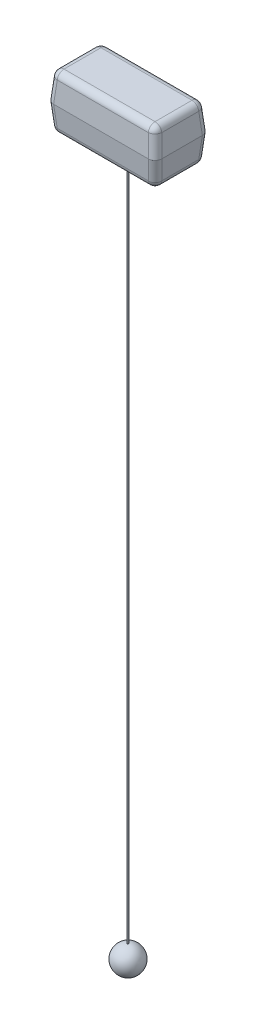
ISO-10303-21;
HEADER;
FILE_DESCRIPTION(('STEP AP214'),'2;1');
FILE_NAME('part.step','',(''),(''),'','','');
FILE_SCHEMA(('AUTOMOTIVE_DESIGN { 1 0 10303 214 1 1 1 1 }'));
ENDSEC;
DATA;
#1=APPLICATION_CONTEXT('core data for automotive mechanical design processes');
#2=APPLICATION_PROTOCOL_DEFINITION('international standard','automotive_design',2000,#1);
#3=PRODUCT_CONTEXT('',#1,'mechanical');
#4=PRODUCT('Part','Part','',(#3));
#5=PRODUCT_RELATED_PRODUCT_CATEGORY('part','',(#4));
#6=PRODUCT_DEFINITION_FORMATION('','',#4);
#7=PRODUCT_DEFINITION_CONTEXT('part definition',#1,'design');
#8=PRODUCT_DEFINITION('design','',#6,#7);
#9=PRODUCT_DEFINITION_SHAPE('','',#8);
#10=(LENGTH_UNIT() NAMED_UNIT(*) SI_UNIT(.MILLI.,.METRE.));
#11=(NAMED_UNIT(*) PLANE_ANGLE_UNIT() SI_UNIT($,.RADIAN.));
#12=(NAMED_UNIT(*) SI_UNIT($,.STERADIAN.) SOLID_ANGLE_UNIT());
#13=UNCERTAINTY_MEASURE_WITH_UNIT(LENGTH_MEASURE(1.E-05),#10,'distance_accuracy_value','');
#14=(GEOMETRIC_REPRESENTATION_CONTEXT(3) GLOBAL_UNCERTAINTY_ASSIGNED_CONTEXT((#13)) GLOBAL_UNIT_ASSIGNED_CONTEXT((#10,
#11,#12)) REPRESENTATION_CONTEXT('',''));
#15=CARTESIAN_POINT('',(0.,0.,0.));
#16=DIRECTION('',(0.,0.,1.));
#17=DIRECTION('',(1.,0.,0.));
#18=AXIS2_PLACEMENT_3D('',#15,#16,#17);
#19=CARTESIAN_POINT('',(0.,-685.8,0.));
#20=DIRECTION('',(0.,-1.,0.));
#21=DIRECTION('',(1.,0.,0.));
#22=AXIS2_PLACEMENT_3D('',#19,#20,#21);
#23=SPHERICAL_SURFACE('',#22,12.7);
#24=CARTESIAN_POINT('',(0.,-698.5,0.));
#25=VERTEX_POINT('',#24);
#26=VERTEX_LOOP('',#25);
#27=FACE_BOUND('',#26,.T.);
#28=ADVANCED_FACE('F40',(#27),#23,.T.);
#29=CLOSED_SHELL('',(#28));
#30=MANIFOLD_SOLID_BREP('B2',#29);
#31=CARTESIAN_POINT('',(0.,-685.8,0.));
#32=DIRECTION('',(0.,1.,0.));
#33=DIRECTION('',(0.,0.,1.));
#34=AXIS2_PLACEMENT_3D('',#31,#32,#33);
#35=CYLINDRICAL_SURFACE('',#34,0.635);
#36=CARTESIAN_POINT('',(0.,-685.8,0.));
#37=DIRECTION('',(0.,-1.,0.));
#38=DIRECTION('',(0.,0.,-1.));
#39=AXIS2_PLACEMENT_3D('',#36,#37,#38);
#40=CIRCLE('',#39,0.635);
#41=CARTESIAN_POINT('',(0.,-685.8,-0.635));
#42=VERTEX_POINT('',#41);
#43=EDGE_CURVE('E39',#42,#42,#40,.T.);
#44=ORIENTED_EDGE('',*,*,#43,.F.);
#45=EDGE_LOOP('',(#44));
#46=FACE_BOUND('',#45,.T.);
#47=CARTESIAN_POINT('',(0.,-25.4,0.));
#48=DIRECTION('',(0.,-1.,0.));
#49=DIRECTION('',(0.,0.,-1.));
#50=AXIS2_PLACEMENT_3D('',#47,#48,#49);
#51=CIRCLE('',#50,0.635);
#52=CARTESIAN_POINT('',(0.,-25.4,-0.635));
#53=VERTEX_POINT('',#52);
#54=EDGE_CURVE('E65',#53,#53,#51,.T.);
#55=ORIENTED_EDGE('',*,*,#54,.T.);
#56=EDGE_LOOP('',(#55));
#57=FACE_BOUND('',#56,.T.);
#58=ADVANCED_FACE('F62',(#46,#57),#35,.T.);
#59=CARTESIAN_POINT('',(0.,-685.8,0.));
#60=DIRECTION('',(0.,-1.,0.));
#61=DIRECTION('',(0.,0.,-1.));
#62=AXIS2_PLACEMENT_3D('',#59,#60,#61);
#63=PLANE('',#62);
#64=ORIENTED_EDGE('',*,*,#43,.T.);
#65=EDGE_LOOP('',(#64));
#66=FACE_BOUND('',#65,.T.);
#67=ADVANCED_FACE('F77',(#66),#63,.T.);
#68=CARTESIAN_POINT('',(0.,-25.4,0.));
#69=DIRECTION('',(0.,-1.,0.));
#70=DIRECTION('',(0.,0.,-1.));
#71=AXIS2_PLACEMENT_3D('',#68,#69,#70);
#72=PLANE('',#71);
#73=ORIENTED_EDGE('',*,*,#54,.F.);
#74=EDGE_LOOP('',(#73));
#75=FACE_BOUND('',#74,.T.);
#76=ADVANCED_FACE('F75',(#75),#72,.F.);
#77=CLOSED_SHELL('',(#58,#67,#76));
#78=MANIFOLD_SOLID_BREP('B6',#77);
#79=CARTESIAN_POINT('',(50.8,0.,25.4));
#80=DIRECTION('',(0.996194698091746,-0.0871557427476584,0.));
#81=DIRECTION('',(0.0871557427476584,0.996194698091746,0.));
#82=AXIS2_PLACEMENT_3D('',#79,#80,#81);
#83=PLANE('',#82);
#84=DIRECTION('',(0.,0.,-1.));
#85=VECTOR('',#84,1.);
#86=CARTESIAN_POINT('',(49.0849213243135,-19.6034389664476,25.4));
#87=LINE('',#86,#85);
#88=CARTESIAN_POINT('',(49.0849213243135,-19.6034389664476,17.3590849914309));
#89=VERTEX_POINT('',#88);
#90=CARTESIAN_POINT('',(49.0849213243135,-19.6034389664476,-17.3590849914309));
#91=VERTEX_POINT('',#90);
#92=EDGE_CURVE('E283',#89,#91,#87,.T.);
#93=ORIENTED_EDGE('',*,*,#92,.T.);
#94=DIRECTION('',(0.0868265938642478,0.992432509138967,-0.0868265938642478));
#95=VECTOR('',#94,1.);
#96=CARTESIAN_POINT('',(50.4647156220374,-3.83231797641118,-18.7388792891548));
#97=LINE('',#96,#95);
#98=CARTESIAN_POINT('',(50.8,0.,-19.0741636671174));
#99=VERTEX_POINT('',#98);
#100=EDGE_CURVE('E286',#91,#99,#97,.T.);
#101=ORIENTED_EDGE('',*,*,#100,.T.);
#102=DIRECTION('',(0.,0.,-1.));
#103=VECTOR('',#102,1.);
#104=CARTESIAN_POINT('',(50.8,0.,25.4));
#105=LINE('',#104,#103);
#106=CARTESIAN_POINT('',(50.8,0.,19.0741636671174));
#107=VERTEX_POINT('',#106);
#108=EDGE_CURVE('E236',#107,#99,#105,.T.);
#109=ORIENTED_EDGE('',*,*,#108,.F.);
#110=DIRECTION('',(0.0868265938642478,0.992432509138967,0.0868265938642478));
#111=VECTOR('',#110,1.);
#112=CARTESIAN_POINT('',(50.8476895780624,0.545094371550039,19.1218532451798));
#113=LINE('',#112,#111);
#114=EDGE_CURVE('E281',#107,#89,#113,.F.);
#115=ORIENTED_EDGE('',*,*,#114,.T.);
#116=EDGE_LOOP('',(#93,#101,#109,#115));
#117=FACE_BOUND('',#116,.T.);
#118=ADVANCED_FACE('F103',(#117),#83,.T.);
#119=CARTESIAN_POINT('',(-50.8,0.,25.4));
#120=DIRECTION('',(0.,-0.0871557427476584,0.996194698091746));
#121=DIRECTION('',(0.,-0.996194698091746,-0.0871557427476584));
#122=AXIS2_PLACEMENT_3D('',#119,#120,#121);
#123=PLANE('',#122);
#124=DIRECTION('',(1.,0.,0.));
#125=VECTOR('',#124,1.);
#126=CARTESIAN_POINT('',(-50.8,0.,25.4));
#127=LINE('',#126,#125);
#128=CARTESIAN_POINT('',(-44.4741636671174,0.,25.4));
#129=VERTEX_POINT('',#128);
#130=CARTESIAN_POINT('',(44.4741636671174,0.,25.4));
#131=VERTEX_POINT('',#130);
#132=EDGE_CURVE('E250',#129,#131,#127,.T.);
#133=ORIENTED_EDGE('',*,*,#132,.F.);
#134=DIRECTION('',(-0.0868265938642478,0.992432509138967,0.0868265938642478));
#135=VECTOR('',#134,1.);
#136=CARTESIAN_POINT('',(-44.5218532451798,0.545094371550039,25.4476895780624));
#137=LINE('',#136,#135);
#138=CARTESIAN_POINT('',(-42.7590849914309,-19.6034389664476,23.6849213243135));
#139=VERTEX_POINT('',#138);
#140=EDGE_CURVE('E279',#129,#139,#137,.F.);
#141=ORIENTED_EDGE('',*,*,#140,.T.);
#142=DIRECTION('',(1.,0.,0.));
#143=VECTOR('',#142,1.);
#144=CARTESIAN_POINT('',(-50.8,-19.6034389664476,23.6849213243135));
#145=LINE('',#144,#143);
#146=CARTESIAN_POINT('',(42.7590849914309,-19.6034389664476,23.6849213243135));
#147=VERTEX_POINT('',#146);
#148=EDGE_CURVE('E276',#139,#147,#145,.T.);
#149=ORIENTED_EDGE('',*,*,#148,.T.);
#150=DIRECTION('',(0.0868265938642478,0.992432509138967,0.0868265938642478));
#151=VECTOR('',#150,1.);
#152=CARTESIAN_POINT('',(43.7559053331298,-8.20973032437241,24.6817416660124));
#153=LINE('',#152,#151);
#154=EDGE_CURVE('E274',#147,#131,#153,.T.);
#155=ORIENTED_EDGE('',*,*,#154,.T.);
#156=EDGE_LOOP('',(#133,#141,#149,#155));
#157=FACE_BOUND('',#156,.T.);
#158=ADVANCED_FACE('F411',(#157),#123,.T.);
#159=CARTESIAN_POINT('',(-50.8,0.,25.4));
#160=DIRECTION('',(-0.996194698091746,-0.0871557427476584,0.));
#161=DIRECTION('',(0.0871557427476584,-0.996194698091746,0.));
#162=AXIS2_PLACEMENT_3D('',#159,#160,#161);
#163=PLANE('',#162);
#164=DIRECTION('',(0.,0.,1.));
#165=VECTOR('',#164,1.);
#166=CARTESIAN_POINT('',(-50.8,0.,25.4));
#167=LINE('',#166,#165);
#168=CARTESIAN_POINT('',(-50.8,0.,-19.0741636671174));
#169=VERTEX_POINT('',#168);
#170=CARTESIAN_POINT('',(-50.8,0.,19.0741636671174));
#171=VERTEX_POINT('',#170);
#172=EDGE_CURVE('E235',#169,#171,#167,.T.);
#173=ORIENTED_EDGE('',*,*,#172,.F.);
#174=DIRECTION('',(-0.0868265938642478,0.992432509138967,-0.0868265938642478));
#175=VECTOR('',#174,1.);
#176=CARTESIAN_POINT('',(-50.4647156220374,-3.83231797641118,-18.7388792891548));
#177=LINE('',#176,#175);
#178=CARTESIAN_POINT('',(-49.0849213243135,-19.6034389664476,-17.3590849914309));
#179=VERTEX_POINT('',#178);
#180=EDGE_CURVE('E272',#169,#179,#177,.F.);
#181=ORIENTED_EDGE('',*,*,#180,.T.);
#182=DIRECTION('',(0.,0.,1.));
#183=VECTOR('',#182,1.);
#184=CARTESIAN_POINT('',(-49.0849213243135,-19.6034389664476,25.4));
#185=LINE('',#184,#183);
#186=CARTESIAN_POINT('',(-49.0849213243135,-19.6034389664476,17.3590849914309));
#187=VERTEX_POINT('',#186);
#188=EDGE_CURVE('E269',#179,#187,#185,.T.);
#189=ORIENTED_EDGE('',*,*,#188,.T.);
#190=DIRECTION('',(-0.0868265938642478,0.992432509138967,0.0868265938642478));
#191=VECTOR('',#190,1.);
#192=CARTESIAN_POINT('',(-50.8476895780624,0.545094371550039,19.1218532451798));
#193=LINE('',#192,#191);
#194=EDGE_CURVE('E267',#187,#171,#193,.T.);
#195=ORIENTED_EDGE('',*,*,#194,.T.);
#196=EDGE_LOOP('',(#173,#181,#189,#195));
#197=FACE_BOUND('',#196,.T.);
#198=ADVANCED_FACE('F459',(#197),#163,.T.);
#199=CARTESIAN_POINT('',(-50.8,0.,-25.4));
#200=DIRECTION('',(0.,-0.0871557427476584,-0.996194698091746));
#201=DIRECTION('',(0.,0.996194698091746,-0.0871557427476584));
#202=AXIS2_PLACEMENT_3D('',#199,#200,#201);
#203=PLANE('',#202);
#204=DIRECTION('',(-1.,0.,0.));
#205=VECTOR('',#204,1.);
#206=CARTESIAN_POINT('',(-50.8,-19.6034389664476,-23.6849213243135));
#207=LINE('',#206,#205);
#208=CARTESIAN_POINT('',(42.7590849914309,-19.6034389664476,-23.6849213243135));
#209=VERTEX_POINT('',#208);
#210=CARTESIAN_POINT('',(-42.7590849914309,-19.6034389664476,-23.6849213243135));
#211=VERTEX_POINT('',#210);
#212=EDGE_CURVE('E249',#209,#211,#207,.T.);
#213=ORIENTED_EDGE('',*,*,#212,.T.);
#214=DIRECTION('',(-0.0868265938642478,0.992432509138967,-0.0868265938642478));
#215=VECTOR('',#214,1.);
#216=CARTESIAN_POINT('',(-44.5218532451798,0.545094371550039,-25.4476895780624));
#217=LINE('',#216,#215);
#218=CARTESIAN_POINT('',(-44.4741636671174,0.,-25.4));
#219=VERTEX_POINT('',#218);
#220=EDGE_CURVE('E234',#211,#219,#217,.T.);
#221=ORIENTED_EDGE('',*,*,#220,.T.);
#222=DIRECTION('',(-1.,0.,0.));
#223=VECTOR('',#222,1.);
#224=CARTESIAN_POINT('',(-50.8,0.,-25.4));
#225=LINE('',#224,#223);
#226=CARTESIAN_POINT('',(44.4741636671174,0.,-25.4));
#227=VERTEX_POINT('',#226);
#228=EDGE_CURVE('E217',#227,#219,#225,.T.);
#229=ORIENTED_EDGE('',*,*,#228,.F.);
#230=DIRECTION('',(0.0868265938642478,0.992432509138967,-0.0868265938642478));
#231=VECTOR('',#230,1.);
#232=CARTESIAN_POINT('',(43.7559053331298,-8.20973032437241,-24.6817416660124));
#233=LINE('',#232,#231);
#234=EDGE_CURVE('E231',#227,#209,#233,.F.);
#235=ORIENTED_EDGE('',*,*,#234,.T.);
#236=EDGE_LOOP('',(#213,#221,#229,#235));
#237=FACE_BOUND('',#236,.T.);
#238=ADVANCED_FACE('F229',(#237),#203,.T.);
#239=CARTESIAN_POINT('',(50.8,-25.4,-25.4));
#240=DIRECTION('',(0.,-1.,0.));
#241=DIRECTION('',(0.,0.,-1.));
#242=AXIS2_PLACEMENT_3D('',#239,#240,#241);
#243=PLANE('',#242);
#244=DIRECTION('',(0.,0.,1.));
#245=VECTOR('',#244,1.);
#246=CARTESIAN_POINT('',(-42.7590849914309,-25.4,-25.4));
#247=LINE('',#246,#245);
#248=CARTESIAN_POINT('',(-42.7590849914309,-25.4,17.3590849914309));
#249=VERTEX_POINT('',#248);
#250=CARTESIAN_POINT('',(-42.7590849914309,-25.4,-17.3590849914309));
#251=VERTEX_POINT('',#250);
#252=EDGE_CURVE('E262',#249,#251,#247,.F.);
#253=ORIENTED_EDGE('',*,*,#252,.T.);
#254=DIRECTION('',(-1.,0.,0.));
#255=VECTOR('',#254,1.);
#256=CARTESIAN_POINT('',(50.8,-25.4,-17.3590849914309));
#257=LINE('',#256,#255);
#258=CARTESIAN_POINT('',(42.7590849914309,-25.4,-17.3590849914309));
#259=VERTEX_POINT('',#258);
#260=EDGE_CURVE('E264',#251,#259,#257,.F.);
#261=ORIENTED_EDGE('',*,*,#260,.T.);
#262=DIRECTION('',(0.,0.,-1.));
#263=VECTOR('',#262,1.);
#264=CARTESIAN_POINT('',(42.7590849914309,-25.4,-25.4));
#265=LINE('',#264,#263);
#266=CARTESIAN_POINT('',(42.7590849914309,-25.4,17.3590849914309));
#267=VERTEX_POINT('',#266);
#268=EDGE_CURVE('E258',#259,#267,#265,.F.);
#269=ORIENTED_EDGE('',*,*,#268,.T.);
#270=DIRECTION('',(1.,0.,0.));
#271=VECTOR('',#270,1.);
#272=CARTESIAN_POINT('',(50.8,-25.4,17.3590849914309));
#273=LINE('',#272,#271);
#274=EDGE_CURVE('E260',#267,#249,#273,.F.);
#275=ORIENTED_EDGE('',*,*,#274,.T.);
#276=EDGE_LOOP('',(#253,#261,#269,#275));
#277=FACE_BOUND('',#276,.T.);
#278=ADVANCED_FACE('F486',(#277),#243,.T.);
#279=CARTESIAN_POINT('',(50.8,0.,25.4));
#280=DIRECTION('',(0.996194698091746,0.0871557427476584,0.));
#281=DIRECTION('',(-0.0871557427476584,0.996194698091746,0.));
#282=AXIS2_PLACEMENT_3D('',#279,#280,#281);
#283=PLANE('',#282);
#284=ORIENTED_EDGE('',*,*,#108,.T.);
#285=DIRECTION('',(-0.0868265938642478,0.992432509138967,0.0868265938642478));
#286=VECTOR('',#285,1.);
#287=CARTESIAN_POINT('',(50.4647156220374,3.83231797641118,-18.7388792891548));
#288=LINE('',#287,#286);
#289=CARTESIAN_POINT('',(49.0849213243135,19.6034389664476,-17.3590849914309));
#290=VERTEX_POINT('',#289);
#291=EDGE_CURVE('E60',#99,#290,#288,.T.);
#292=ORIENTED_EDGE('',*,*,#291,.T.);
#293=DIRECTION('',(0.,0.,-1.));
#294=VECTOR('',#293,1.);
#295=CARTESIAN_POINT('',(49.0849213243135,19.6034389664476,25.4));
#296=LINE('',#295,#294);
#297=CARTESIAN_POINT('',(49.0849213243135,19.6034389664476,17.3590849914309));
#298=VERTEX_POINT('',#297);
#299=EDGE_CURVE('E112',#290,#298,#296,.F.);
#300=ORIENTED_EDGE('',*,*,#299,.T.);
#301=DIRECTION('',(-0.0868265938642478,0.992432509138967,-0.0868265938642478));
#302=VECTOR('',#301,1.);
#303=CARTESIAN_POINT('',(50.8476895780624,-0.545094371550039,19.1218532451798));
#304=LINE('',#303,#302);
#305=EDGE_CURVE('E311',#298,#107,#304,.F.);
#306=ORIENTED_EDGE('',*,*,#305,.T.);
#307=EDGE_LOOP('',(#284,#292,#300,#306));
#308=FACE_BOUND('',#307,.T.);
#309=ADVANCED_FACE('F695',(#308),#283,.T.);
#310=CARTESIAN_POINT('',(-50.8,0.,-25.4));
#311=DIRECTION('',(0.,0.0871557427476584,-0.996194698091746));
#312=DIRECTION('',(0.,0.996194698091746,0.0871557427476584));
#313=AXIS2_PLACEMENT_3D('',#310,#311,#312);
#314=PLANE('',#313);
#315=ORIENTED_EDGE('',*,*,#228,.T.);
#316=DIRECTION('',(0.0868265938642478,0.992432509138967,0.0868265938642478));
#317=VECTOR('',#316,1.);
#318=CARTESIAN_POINT('',(-44.5218532451798,-0.545094371550039,-25.4476895780624));
#319=LINE('',#318,#317);
#320=CARTESIAN_POINT('',(-42.7590849914309,19.6034389664476,-23.6849213243135));
#321=VERTEX_POINT('',#320);
#322=EDGE_CURVE('E309',#219,#321,#319,.T.);
#323=ORIENTED_EDGE('',*,*,#322,.T.);
#324=DIRECTION('',(-1.,0.,0.));
#325=VECTOR('',#324,1.);
#326=CARTESIAN_POINT('',(-50.8,19.6034389664476,-23.6849213243135));
#327=LINE('',#326,#325);
#328=CARTESIAN_POINT('',(42.7590849914309,19.6034389664476,-23.6849213243135));
#329=VERTEX_POINT('',#328);
#330=EDGE_CURVE('E220',#321,#329,#327,.F.);
#331=ORIENTED_EDGE('',*,*,#330,.T.);
#332=DIRECTION('',(-0.0868265938642478,0.992432509138967,0.0868265938642478));
#333=VECTOR('',#332,1.);
#334=CARTESIAN_POINT('',(43.7559053331298,8.20973032437241,-24.6817416660124));
#335=LINE('',#334,#333);
#336=EDGE_CURVE('E214',#329,#227,#335,.F.);
#337=ORIENTED_EDGE('',*,*,#336,.T.);
#338=EDGE_LOOP('',(#315,#323,#331,#337));
#339=FACE_BOUND('',#338,.T.);
#340=ADVANCED_FACE('F216',(#339),#314,.T.);
#341=CARTESIAN_POINT('',(-50.8,0.,25.4));
#342=DIRECTION('',(-0.996194698091746,0.0871557427476584,0.));
#343=DIRECTION('',(-0.0871557427476584,-0.996194698091746,0.));
#344=AXIS2_PLACEMENT_3D('',#341,#342,#343);
#345=PLANE('',#344);
#346=DIRECTION('',(0.,0.,1.));
#347=VECTOR('',#346,1.);
#348=CARTESIAN_POINT('',(-49.0849213243135,19.6034389664476,25.4));
#349=LINE('',#348,#347);
#350=CARTESIAN_POINT('',(-49.0849213243135,19.6034389664476,17.3590849914309));
#351=VERTEX_POINT('',#350);
#352=CARTESIAN_POINT('',(-49.0849213243135,19.6034389664476,-17.3590849914309));
#353=VERTEX_POINT('',#352);
#354=EDGE_CURVE('E305',#351,#353,#349,.F.);
#355=ORIENTED_EDGE('',*,*,#354,.T.);
#356=DIRECTION('',(0.0868265938642478,0.992432509138967,0.0868265938642478));
#357=VECTOR('',#356,1.);
#358=CARTESIAN_POINT('',(-50.4647156220374,3.83231797641118,-18.7388792891548));
#359=LINE('',#358,#357);
#360=EDGE_CURVE('E225',#353,#169,#359,.F.);
#361=ORIENTED_EDGE('',*,*,#360,.T.);
#362=ORIENTED_EDGE('',*,*,#172,.T.);
#363=DIRECTION('',(0.0868265938642478,0.992432509138967,-0.0868265938642478));
#364=VECTOR('',#363,1.);
#365=CARTESIAN_POINT('',(-50.8476895780624,-0.545094371550039,19.1218532451798));
#366=LINE('',#365,#364);
#367=EDGE_CURVE('E303',#171,#351,#366,.T.);
#368=ORIENTED_EDGE('',*,*,#367,.T.);
#369=EDGE_LOOP('',(#355,#361,#362,#368));
#370=FACE_BOUND('',#369,.T.);
#371=ADVANCED_FACE('F395',(#370),#345,.T.);
#372=CARTESIAN_POINT('',(-50.8,0.,25.4));
#373=DIRECTION('',(0.,0.0871557427476584,0.996194698091746));
#374=DIRECTION('',(0.,-0.996194698091746,0.0871557427476584));
#375=AXIS2_PLACEMENT_3D('',#372,#373,#374);
#376=PLANE('',#375);
#377=DIRECTION('',(1.,0.,0.));
#378=VECTOR('',#377,1.);
#379=CARTESIAN_POINT('',(-50.8,19.6034389664476,23.6849213243135));
#380=LINE('',#379,#378);
#381=CARTESIAN_POINT('',(42.7590849914309,19.6034389664476,23.6849213243135));
#382=VERTEX_POINT('',#381);
#383=CARTESIAN_POINT('',(-42.7590849914309,19.6034389664476,23.6849213243135));
#384=VERTEX_POINT('',#383);
#385=EDGE_CURVE('E299',#382,#384,#380,.F.);
#386=ORIENTED_EDGE('',*,*,#385,.T.);
#387=DIRECTION('',(0.0868265938642478,0.992432509138967,-0.0868265938642478));
#388=VECTOR('',#387,1.);
#389=CARTESIAN_POINT('',(-44.5218532451798,-0.545094371550039,25.4476895780624));
#390=LINE('',#389,#388);
#391=EDGE_CURVE('E301',#384,#129,#390,.F.);
#392=ORIENTED_EDGE('',*,*,#391,.T.);
#393=ORIENTED_EDGE('',*,*,#132,.T.);
#394=DIRECTION('',(-0.0868265938642478,0.992432509138967,-0.0868265938642478));
#395=VECTOR('',#394,1.);
#396=CARTESIAN_POINT('',(43.7559053331298,8.2097303243724,24.6817416660124));
#397=LINE('',#396,#395);
#398=EDGE_CURVE('E297',#131,#382,#397,.T.);
#399=ORIENTED_EDGE('',*,*,#398,.T.);
#400=EDGE_LOOP('',(#386,#392,#393,#399));
#401=FACE_BOUND('',#400,.T.);
#402=ADVANCED_FACE('F428',(#401),#376,.T.);
#403=CARTESIAN_POINT('',(50.8,25.4,-25.4));
#404=DIRECTION('',(0.,-1.,0.));
#405=DIRECTION('',(0.,0.,-1.));
#406=AXIS2_PLACEMENT_3D('',#403,#404,#405);
#407=PLANE('',#406);
#408=DIRECTION('',(0.,0.,-1.));
#409=VECTOR('',#408,1.);
#410=CARTESIAN_POINT('',(-42.7590849914309,25.4,-25.4));
#411=LINE('',#410,#409);
#412=CARTESIAN_POINT('',(-42.7590849914309,25.4,-17.3590849914309));
#413=VERTEX_POINT('',#412);
#414=CARTESIAN_POINT('',(-42.7590849914309,25.4,17.3590849914309));
#415=VERTEX_POINT('',#414);
#416=EDGE_CURVE('E292',#413,#415,#411,.F.);
#417=ORIENTED_EDGE('',*,*,#416,.T.);
#418=DIRECTION('',(-1.,0.,0.));
#419=VECTOR('',#418,1.);
#420=CARTESIAN_POINT('',(50.8,25.4,17.3590849914309));
#421=LINE('',#420,#419);
#422=CARTESIAN_POINT('',(42.7590849914309,25.4,17.3590849914309));
#423=VERTEX_POINT('',#422);
#424=EDGE_CURVE('E294',#415,#423,#421,.F.);
#425=ORIENTED_EDGE('',*,*,#424,.T.);
#426=DIRECTION('',(0.,0.,1.));
#427=VECTOR('',#426,1.);
#428=CARTESIAN_POINT('',(42.7590849914309,25.4,-25.4));
#429=LINE('',#428,#427);
#430=CARTESIAN_POINT('',(42.7590849914309,25.4,-17.3590849914309));
#431=VERTEX_POINT('',#430);
#432=EDGE_CURVE('E288',#423,#431,#429,.F.);
#433=ORIENTED_EDGE('',*,*,#432,.T.);
#434=DIRECTION('',(1.,0.,0.));
#435=VECTOR('',#434,1.);
#436=CARTESIAN_POINT('',(50.8,25.4,-17.3590849914309));
#437=LINE('',#436,#435);
#438=EDGE_CURVE('E290',#431,#413,#437,.F.);
#439=ORIENTED_EDGE('',*,*,#438,.T.);
#440=EDGE_LOOP('',(#417,#425,#433,#439));
#441=FACE_BOUND('',#440,.T.);
#442=ADVANCED_FACE('F438',(#441),#407,.F.);
#443=CARTESIAN_POINT('',(50.8,19.05,17.3590849914309));
#444=DIRECTION('',(-1.,0.,0.));
#445=DIRECTION('',(0.,0.,1.));
#446=AXIS2_PLACEMENT_3D('',#443,#444,#445);
#447=CYLINDRICAL_SURFACE('',#446,6.35);
#448=CARTESIAN_POINT('',(42.7590849914309,19.05,17.3590849914309));
#449=DIRECTION('',(1.,0.,0.));
#450=DIRECTION('',(0.,0.,-1.));
#451=AXIS2_PLACEMENT_3D('',#448,#449,#450);
#452=CIRCLE('',#451,6.35);
#453=EDGE_CURVE('E107',#423,#382,#452,.T.);
#454=ORIENTED_EDGE('',*,*,#453,.F.);
#455=ORIENTED_EDGE('',*,*,#424,.F.);
#456=CARTESIAN_POINT('',(-42.7590849914309,19.05,17.3590849914309));
#457=DIRECTION('',(-1.,0.,0.));
#458=DIRECTION('',(0.,0.,1.));
#459=AXIS2_PLACEMENT_3D('',#456,#457,#458);
#460=CIRCLE('',#459,6.35);
#461=EDGE_CURVE('E378',#384,#415,#460,.T.);
#462=ORIENTED_EDGE('',*,*,#461,.F.);
#463=ORIENTED_EDGE('',*,*,#385,.F.);
#464=EDGE_LOOP('',(#454,#455,#462,#463));
#465=FACE_BOUND('',#464,.T.);
#466=ADVANCED_FACE('F105',(#465),#447,.T.);
#467=CARTESIAN_POINT('',(42.7590849914309,19.05,17.3590849914309));
#468=DIRECTION('',(0.,0.,1.));
#469=DIRECTION('',(1.,0.,0.));
#470=AXIS2_PLACEMENT_3D('',#467,#468,#469);
#471=SPHERICAL_SURFACE('',#470,6.35);
#472=CARTESIAN_POINT('',(42.7590849914309,19.05,17.3590849914309));
#473=DIRECTION('',(0.,0.,1.));
#474=DIRECTION('',(0.,-1.,0.));
#475=AXIS2_PLACEMENT_3D('',#472,#473,#474);
#476=CIRCLE('',#475,6.35);
#477=EDGE_CURVE('E374',#423,#298,#476,.F.);
#478=ORIENTED_EDGE('',*,*,#477,.F.);
#479=ORIENTED_EDGE('',*,*,#453,.T.);
#480=CARTESIAN_POINT('',(42.7590849914309,19.05,17.3590849914309));
#481=DIRECTION('',(-0.0868265938642476,0.992432509138967,-0.0868265938642477));
#482=DIRECTION('',(0.,0.0871557427476583,0.996194698091746));
#483=AXIS2_PLACEMENT_3D('',#480,#481,#482);
#484=CIRCLE('',#483,6.35);
#485=EDGE_CURVE('E376',#298,#382,#484,.F.);
#486=ORIENTED_EDGE('',*,*,#485,.F.);
#487=EDGE_LOOP('',(#478,#479,#486));
#488=FACE_BOUND('',#487,.T.);
#489=ADVANCED_FACE('F433',(#488),#471,.T.);
#490=CARTESIAN_POINT('',(-42.7590849914309,19.05,17.3590849914309));
#491=DIRECTION('',(0.,0.,1.));
#492=DIRECTION('',(1.,0.,0.));
#493=AXIS2_PLACEMENT_3D('',#490,#491,#492);
#494=SPHERICAL_SURFACE('',#493,6.35);
#495=CARTESIAN_POINT('',(-42.7590849914309,19.05,17.3590849914309));
#496=DIRECTION('',(0.0868265938642477,0.992432509138967,-0.0868265938642477));
#497=DIRECTION('',(0.,0.0871557427476583,0.996194698091746));
#498=AXIS2_PLACEMENT_3D('',#495,#496,#497);
#499=CIRCLE('',#498,6.35);
#500=EDGE_CURVE('E368',#384,#351,#499,.F.);
#501=ORIENTED_EDGE('',*,*,#500,.F.);
#502=ORIENTED_EDGE('',*,*,#461,.T.);
#503=CARTESIAN_POINT('',(-42.7590849914309,19.05,17.3590849914309));
#504=DIRECTION('',(0.,0.,1.));
#505=DIRECTION('',(1.,0.,0.));
#506=AXIS2_PLACEMENT_3D('',#503,#504,#505);
#507=CIRCLE('',#506,6.35);
#508=EDGE_CURVE('E371',#351,#415,#507,.F.);
#509=ORIENTED_EDGE('',*,*,#508,.F.);
#510=EDGE_LOOP('',(#501,#502,#509));
#511=FACE_BOUND('',#510,.T.);
#512=ADVANCED_FACE('F647',(#511),#494,.T.);
#513=CARTESIAN_POINT('',(44.5218532451798,-1.09853333799767,19.1218532451798));
#514=DIRECTION('',(0.0868265938642478,-0.992432509138967,0.0868265938642478));
#515=DIRECTION('',(0.,-0.0871557427476584,-0.996194698091746));
#516=AXIS2_PLACEMENT_3D('',#513,#514,#515);
#517=CYLINDRICAL_SURFACE('',#516,6.35);
#518=ORIENTED_EDGE('',*,*,#485,.T.);
#519=ORIENTED_EDGE('',*,*,#398,.F.);
#520=CARTESIAN_POINT('',(44.4257440315997,0.,19.0257440315997));
#521=DIRECTION('',(0.,1.,0.));
#522=DIRECTION('',(0.707106781186548,0.,0.707106781186548));
#523=AXIS2_PLACEMENT_3D('',#520,#521,#522);
#524=ELLIPSE('',#523,6.39841998475972,6.35);
#525=EDGE_CURVE('E365',#107,#131,#524,.F.);
#526=ORIENTED_EDGE('',*,*,#525,.F.);
#527=ORIENTED_EDGE('',*,*,#305,.F.);
#528=EDGE_LOOP('',(#518,#519,#526,#527));
#529=FACE_BOUND('',#528,.T.);
#530=ADVANCED_FACE('F431',(#529),#517,.T.);
#531=CARTESIAN_POINT('',(42.7590849914309,19.05,-25.4));
#532=DIRECTION('',(0.,0.,1.));
#533=DIRECTION('',(1.,0.,0.));
#534=AXIS2_PLACEMENT_3D('',#531,#532,#533);
#535=CYLINDRICAL_SURFACE('',#534,6.35);
#536=ORIENTED_EDGE('',*,*,#477,.T.);
#537=ORIENTED_EDGE('',*,*,#299,.F.);
#538=CARTESIAN_POINT('',(42.7590849914309,19.05,-17.3590849914309));
#539=DIRECTION('',(0.,0.,-1.));
#540=DIRECTION('',(-1.,0.,0.));
#541=AXIS2_PLACEMENT_3D('',#538,#539,#540);
#542=CIRCLE('',#541,6.35);
#543=EDGE_CURVE('E362',#431,#290,#542,.T.);
#544=ORIENTED_EDGE('',*,*,#543,.F.);
#545=ORIENTED_EDGE('',*,*,#432,.F.);
#546=EDGE_LOOP('',(#536,#537,#544,#545));
#547=FACE_BOUND('',#546,.T.);
#548=ADVANCED_FACE('F632',(#547),#535,.T.);
#549=CARTESIAN_POINT('',(50.8,19.05,-17.3590849914309));
#550=DIRECTION('',(1.,0.,0.));
#551=DIRECTION('',(0.,0.,-1.));
#552=AXIS2_PLACEMENT_3D('',#549,#550,#551);
#553=CYLINDRICAL_SURFACE('',#552,6.35);
#554=CARTESIAN_POINT('',(-42.7590849914309,19.05,-17.3590849914309));
#555=DIRECTION('',(-1.,0.,0.));
#556=DIRECTION('',(0.,0.,1.));
#557=AXIS2_PLACEMENT_3D('',#554,#555,#556);
#558=CIRCLE('',#557,6.35);
#559=EDGE_CURVE('E356',#413,#321,#558,.T.);
#560=ORIENTED_EDGE('',*,*,#559,.F.);
#561=ORIENTED_EDGE('',*,*,#438,.F.);
#562=CARTESIAN_POINT('',(42.7590849914309,19.05,-17.3590849914309));
#563=DIRECTION('',(1.,0.,0.));
#564=DIRECTION('',(0.,1.,0.));
#565=AXIS2_PLACEMENT_3D('',#562,#563,#564);
#566=CIRCLE('',#565,6.35);
#567=EDGE_CURVE('E359',#329,#431,#566,.T.);
#568=ORIENTED_EDGE('',*,*,#567,.F.);
#569=ORIENTED_EDGE('',*,*,#330,.F.);
#570=EDGE_LOOP('',(#560,#561,#568,#569));
#571=FACE_BOUND('',#570,.T.);
#572=ADVANCED_FACE('F448',(#571),#553,.T.);
#573=CARTESIAN_POINT('',(-42.7590849914309,19.05,-25.4));
#574=DIRECTION('',(0.,0.,-1.));
#575=DIRECTION('',(-1.,0.,0.));
#576=AXIS2_PLACEMENT_3D('',#573,#574,#575);
#577=CYLINDRICAL_SURFACE('',#576,6.35);
#578=ORIENTED_EDGE('',*,*,#508,.T.);
#579=ORIENTED_EDGE('',*,*,#416,.F.);
#580=CARTESIAN_POINT('',(-42.7590849914309,19.05,-17.3590849914309));
#581=DIRECTION('',(0.,0.,-1.));
#582=DIRECTION('',(-1.,0.,0.));
#583=AXIS2_PLACEMENT_3D('',#580,#581,#582);
#584=CIRCLE('',#583,6.35);
#585=EDGE_CURVE('E353',#353,#413,#584,.T.);
#586=ORIENTED_EDGE('',*,*,#585,.F.);
#587=ORIENTED_EDGE('',*,*,#354,.F.);
#588=EDGE_LOOP('',(#578,#579,#586,#587));
#589=FACE_BOUND('',#588,.T.);
#590=ADVANCED_FACE('F444',(#589),#577,.T.);
#591=CARTESIAN_POINT('',(-44.5218532451798,-1.09853333799767,19.1218532451798));
#592=DIRECTION('',(-0.0868265938642478,-0.992432509138967,0.0868265938642478));
#593=DIRECTION('',(0.,-0.0871557427476584,-0.996194698091746));
#594=AXIS2_PLACEMENT_3D('',#591,#592,#593);
#595=CYLINDRICAL_SURFACE('',#594,6.35);
#596=ORIENTED_EDGE('',*,*,#500,.T.);
#597=ORIENTED_EDGE('',*,*,#367,.F.);
#598=CARTESIAN_POINT('',(-44.4257440315997,0.,19.0257440315997));
#599=DIRECTION('',(0.,1.,0.));
#600=DIRECTION('',(-0.707106781186548,0.,0.707106781186548));
#601=AXIS2_PLACEMENT_3D('',#598,#599,#600);
#602=ELLIPSE('',#601,6.39841998475972,6.35);
#603=EDGE_CURVE('E350',#129,#171,#602,.F.);
#604=ORIENTED_EDGE('',*,*,#603,.F.);
#605=ORIENTED_EDGE('',*,*,#391,.F.);
#606=EDGE_LOOP('',(#596,#597,#604,#605));
#607=FACE_BOUND('',#606,.T.);
#608=ADVANCED_FACE('F401',(#607),#595,.T.);
#609=CARTESIAN_POINT('',(43.7559053331298,-7.65629135792478,18.3559053331298));
#610=DIRECTION('',(0.0868265938642478,0.992432509138967,0.0868265938642478));
#611=DIRECTION('',(0.,-0.0871557427476584,0.996194698091746));
#612=AXIS2_PLACEMENT_3D('',#609,#610,#611);
#613=CYLINDRICAL_SURFACE('',#612,6.35);
#614=ORIENTED_EDGE('',*,*,#525,.T.);
#615=ORIENTED_EDGE('',*,*,#154,.F.);
#616=CARTESIAN_POINT('',(42.7590849914309,-19.05,17.3590849914309));
#617=DIRECTION('',(-0.0868265938642477,-0.992432509138967,-0.0868265938642476));
#618=DIRECTION('',(0.996194698091746,-0.0871557427476583,0.));
#619=AXIS2_PLACEMENT_3D('',#616,#617,#618);
#620=CIRCLE('',#619,6.35);
#621=EDGE_CURVE('E345',#89,#147,#620,.T.);
#622=ORIENTED_EDGE('',*,*,#621,.F.);
#623=ORIENTED_EDGE('',*,*,#114,.F.);
#624=EDGE_LOOP('',(#614,#615,#622,#623));
#625=FACE_BOUND('',#624,.T.);
#626=ADVANCED_FACE('F423',(#625),#613,.T.);
#627=CARTESIAN_POINT('',(42.7590849914309,19.05,-17.3590849914309));
#628=DIRECTION('',(0.,0.,1.));
#629=DIRECTION('',(1.,0.,0.));
#630=AXIS2_PLACEMENT_3D('',#627,#628,#629);
#631=SPHERICAL_SURFACE('',#630,6.35);
#632=ORIENTED_EDGE('',*,*,#567,.T.);
#633=ORIENTED_EDGE('',*,*,#543,.T.);
#634=CARTESIAN_POINT('',(42.7590849914309,19.05,-17.3590849914309));
#635=DIRECTION('',(-0.0868265938642477,0.992432509138967,0.0868265938642476));
#636=DIRECTION('',(-0.996194698091746,-0.0871557427476583,0.));
#637=AXIS2_PLACEMENT_3D('',#634,#635,#636);
#638=CIRCLE('',#637,6.35);
#639=EDGE_CURVE('E343',#329,#290,#638,.F.);
#640=ORIENTED_EDGE('',*,*,#639,.F.);
#641=EDGE_LOOP('',(#632,#633,#640));
#642=FACE_BOUND('',#641,.T.);
#643=ADVANCED_FACE('F595',(#642),#631,.T.);
#644=CARTESIAN_POINT('',(-42.7590849914309,19.05,-17.3590849914309));
#645=DIRECTION('',(0.,0.,1.));
#646=DIRECTION('',(1.,0.,0.));
#647=AXIS2_PLACEMENT_3D('',#644,#645,#646);
#648=SPHERICAL_SURFACE('',#647,6.35);
#649=ORIENTED_EDGE('',*,*,#585,.T.);
#650=ORIENTED_EDGE('',*,*,#559,.T.);
#651=CARTESIAN_POINT('',(-42.7590849914309,19.05,-17.3590849914309));
#652=DIRECTION('',(0.0868265938642477,0.992432509138967,0.0868265938642477));
#653=DIRECTION('',(-0.996194698091746,0.0871557427476583,0.));
#654=AXIS2_PLACEMENT_3D('',#651,#652,#653);
#655=CIRCLE('',#654,6.35);
#656=EDGE_CURVE('E340',#353,#321,#655,.F.);
#657=ORIENTED_EDGE('',*,*,#656,.F.);
#658=EDGE_LOOP('',(#649,#650,#657));
#659=FACE_BOUND('',#658,.T.);
#660=ADVANCED_FACE('F451',(#659),#648,.T.);
#661=CARTESIAN_POINT('',(-44.5218532451798,1.09853333799767,19.1218532451798));
#662=DIRECTION('',(-0.0868265938642478,0.992432509138967,0.0868265938642478));
#663=DIRECTION('',(0.,-0.0871557427476584,0.996194698091746));
#664=AXIS2_PLACEMENT_3D('',#661,#662,#663);
#665=CYLINDRICAL_SURFACE('',#664,6.35);
#666=ORIENTED_EDGE('',*,*,#603,.T.);
#667=ORIENTED_EDGE('',*,*,#194,.F.);
#668=CARTESIAN_POINT('',(-42.7590849914309,-19.05,17.3590849914309));
#669=DIRECTION('',(0.0868265938642476,-0.992432509138967,-0.0868265938642477));
#670=DIRECTION('',(0.,0.0871557427476583,-0.996194698091746));
#671=AXIS2_PLACEMENT_3D('',#668,#669,#670);
#672=CIRCLE('',#671,6.35);
#673=EDGE_CURVE('E337',#139,#187,#672,.T.);
#674=ORIENTED_EDGE('',*,*,#673,.F.);
#675=ORIENTED_EDGE('',*,*,#140,.F.);
#676=EDGE_LOOP('',(#666,#667,#674,#675));
#677=FACE_BOUND('',#676,.T.);
#678=ADVANCED_FACE('F406',(#677),#665,.T.);
#679=CARTESIAN_POINT('',(-50.8,-19.05,17.3590849914309));
#680=DIRECTION('',(1.,0.,0.));
#681=DIRECTION('',(0.,0.,-1.));
#682=AXIS2_PLACEMENT_3D('',#679,#680,#681);
#683=CYLINDRICAL_SURFACE('',#682,6.35);
#684=CARTESIAN_POINT('',(42.7590849914309,-19.05,17.3590849914309));
#685=DIRECTION('',(1.,0.,0.));
#686=DIRECTION('',(0.,1.,0.));
#687=AXIS2_PLACEMENT_3D('',#684,#685,#686);
#688=CIRCLE('',#687,6.35);
#689=EDGE_CURVE('E347',#147,#267,#688,.T.);
#690=ORIENTED_EDGE('',*,*,#689,.F.);
#691=ORIENTED_EDGE('',*,*,#148,.F.);
#692=CARTESIAN_POINT('',(-42.7590849914309,-19.05,17.3590849914309));
#693=DIRECTION('',(-1.,0.,0.));
#694=DIRECTION('',(0.,0.,1.));
#695=AXIS2_PLACEMENT_3D('',#692,#693,#694);
#696=CIRCLE('',#695,6.35);
#697=EDGE_CURVE('E334',#249,#139,#696,.T.);
#698=ORIENTED_EDGE('',*,*,#697,.F.);
#699=ORIENTED_EDGE('',*,*,#274,.F.);
#700=EDGE_LOOP('',(#690,#691,#698,#699));
#701=FACE_BOUND('',#700,.T.);
#702=ADVANCED_FACE('F415',(#701),#683,.T.);
#703=CARTESIAN_POINT('',(42.7590849914309,-19.05,17.3590849914309));
#704=DIRECTION('',(0.,0.,1.));
#705=DIRECTION('',(1.,0.,0.));
#706=AXIS2_PLACEMENT_3D('',#703,#704,#705);
#707=SPHERICAL_SURFACE('',#706,6.35);
#708=ORIENTED_EDGE('',*,*,#621,.T.);
#709=ORIENTED_EDGE('',*,*,#689,.T.);
#710=CARTESIAN_POINT('',(42.7590849914309,-19.05,17.3590849914309));
#711=DIRECTION('',(0.,0.,1.));
#712=DIRECTION('',(1.,0.,0.));
#713=AXIS2_PLACEMENT_3D('',#710,#711,#712);
#714=CIRCLE('',#713,6.35);
#715=EDGE_CURVE('E243',#89,#267,#714,.F.);
#716=ORIENTED_EDGE('',*,*,#715,.F.);
#717=EDGE_LOOP('',(#708,#709,#716));
#718=FACE_BOUND('',#717,.T.);
#719=ADVANCED_FACE('F566',(#718),#707,.T.);
#720=CARTESIAN_POINT('',(43.7559053331298,7.65629135792478,-18.3559053331298));
#721=DIRECTION('',(0.0868265938642478,-0.992432509138967,-0.0868265938642478));
#722=DIRECTION('',(0.,0.0871557427476584,-0.996194698091746));
#723=AXIS2_PLACEMENT_3D('',#720,#721,#722);
#724=CYLINDRICAL_SURFACE('',#723,6.35);
#725=ORIENTED_EDGE('',*,*,#639,.T.);
#726=ORIENTED_EDGE('',*,*,#291,.F.);
#727=CARTESIAN_POINT('',(44.4257440315997,0.,-19.0257440315997));
#728=DIRECTION('',(0.,-1.,0.));
#729=DIRECTION('',(0.707106781186548,0.,-0.707106781186548));
#730=AXIS2_PLACEMENT_3D('',#727,#728,#729);
#731=ELLIPSE('',#730,6.39841998475972,6.35);
#732=EDGE_CURVE('E239',#227,#99,#731,.T.);
#733=ORIENTED_EDGE('',*,*,#732,.F.);
#734=ORIENTED_EDGE('',*,*,#336,.F.);
#735=EDGE_LOOP('',(#725,#726,#733,#734));
#736=FACE_BOUND('',#735,.T.);
#737=ADVANCED_FACE('F240',(#736),#724,.T.);
#738=CARTESIAN_POINT('',(-44.1388792891548,3.27887900996355,-18.7388792891548));
#739=DIRECTION('',(-0.0868265938642478,-0.992432509138967,-0.0868265938642478));
#740=DIRECTION('',(0.,0.0871557427476584,-0.996194698091746));
#741=AXIS2_PLACEMENT_3D('',#738,#739,#740);
#742=CYLINDRICAL_SURFACE('',#741,6.35);
#743=ORIENTED_EDGE('',*,*,#656,.T.);
#744=ORIENTED_EDGE('',*,*,#322,.F.);
#745=CARTESIAN_POINT('',(-44.4257440315997,0.,-19.0257440315997));
#746=DIRECTION('',(0.,-1.,0.));
#747=DIRECTION('',(-0.707106781186548,0.,-0.707106781186548));
#748=AXIS2_PLACEMENT_3D('',#745,#746,#747);
#749=ELLIPSE('',#748,6.39841998475972,6.35);
#750=EDGE_CURVE('E244',#169,#219,#749,.T.);
#751=ORIENTED_EDGE('',*,*,#750,.F.);
#752=ORIENTED_EDGE('',*,*,#360,.F.);
#753=EDGE_LOOP('',(#743,#744,#751,#752));
#754=FACE_BOUND('',#753,.T.);
#755=ADVANCED_FACE('F453',(#754),#742,.T.);
#756=CARTESIAN_POINT('',(-42.7590849914309,-19.05,17.3590849914309));
#757=DIRECTION('',(0.,0.,1.));
#758=DIRECTION('',(1.,0.,0.));
#759=AXIS2_PLACEMENT_3D('',#756,#757,#758);
#760=SPHERICAL_SURFACE('',#759,6.35);
#761=ORIENTED_EDGE('',*,*,#697,.T.);
#762=ORIENTED_EDGE('',*,*,#673,.T.);
#763=CARTESIAN_POINT('',(-42.7590849914309,-19.05,17.3590849914309));
#764=DIRECTION('',(0.,0.,1.));
#765=DIRECTION('',(0.,-1.,0.));
#766=AXIS2_PLACEMENT_3D('',#763,#764,#765);
#767=CIRCLE('',#766,6.35);
#768=EDGE_CURVE('E328',#249,#187,#767,.F.);
#769=ORIENTED_EDGE('',*,*,#768,.F.);
#770=EDGE_LOOP('',(#761,#762,#769));
#771=FACE_BOUND('',#770,.T.);
#772=ADVANCED_FACE('F466',(#771),#760,.T.);
#773=CARTESIAN_POINT('',(42.7590849914309,-19.05,25.4));
#774=DIRECTION('',(0.,0.,-1.));
#775=DIRECTION('',(-1.,0.,0.));
#776=AXIS2_PLACEMENT_3D('',#773,#774,#775);
#777=CYLINDRICAL_SURFACE('',#776,6.35);
#778=ORIENTED_EDGE('',*,*,#715,.T.);
#779=ORIENTED_EDGE('',*,*,#268,.F.);
#780=CARTESIAN_POINT('',(42.7590849914309,-19.05,-17.3590849914309));
#781=DIRECTION('',(0.,0.,-1.));
#782=DIRECTION('',(-1.,0.,0.));
#783=AXIS2_PLACEMENT_3D('',#780,#781,#782);
#784=CIRCLE('',#783,6.35);
#785=EDGE_CURVE('E325',#91,#259,#784,.T.);
#786=ORIENTED_EDGE('',*,*,#785,.F.);
#787=ORIENTED_EDGE('',*,*,#92,.F.);
#788=EDGE_LOOP('',(#778,#779,#786,#787));
#789=FACE_BOUND('',#788,.T.);
#790=ADVANCED_FACE('F468',(#789),#777,.T.);
#791=CARTESIAN_POINT('',(44.1388792891548,-3.27887900996355,-18.7388792891548));
#792=DIRECTION('',(0.0868265938642478,0.992432509138967,-0.0868265938642478));
#793=DIRECTION('',(0.,0.0871557427476584,0.996194698091746));
#794=AXIS2_PLACEMENT_3D('',#791,#792,#793);
#795=CYLINDRICAL_SURFACE('',#794,6.35);
#796=ORIENTED_EDGE('',*,*,#732,.T.);
#797=ORIENTED_EDGE('',*,*,#100,.F.);
#798=CARTESIAN_POINT('',(42.7590849914309,-19.05,-17.3590849914309));
#799=DIRECTION('',(-0.0868265938642477,-0.992432509138967,0.0868265938642477));
#800=DIRECTION('',(0.996194698091746,-0.0871557427476583,0.));
#801=AXIS2_PLACEMENT_3D('',#798,#799,#800);
#802=CIRCLE('',#801,6.35);
#803=EDGE_CURVE('E247',#209,#91,#802,.T.);
#804=ORIENTED_EDGE('',*,*,#803,.F.);
#805=ORIENTED_EDGE('',*,*,#234,.F.);
#806=EDGE_LOOP('',(#796,#797,#804,#805));
#807=FACE_BOUND('',#806,.T.);
#808=ADVANCED_FACE('F246',(#807),#795,.T.);
#809=CARTESIAN_POINT('',(-44.5218532451798,1.09853333799767,-19.1218532451798));
#810=DIRECTION('',(-0.0868265938642478,0.992432509138967,-0.0868265938642478));
#811=DIRECTION('',(0.,0.0871557427476584,0.996194698091746));
#812=AXIS2_PLACEMENT_3D('',#809,#810,#811);
#813=CYLINDRICAL_SURFACE('',#812,6.35);
#814=ORIENTED_EDGE('',*,*,#750,.T.);
#815=ORIENTED_EDGE('',*,*,#220,.F.);
#816=CARTESIAN_POINT('',(-42.7590849914309,-19.05,-17.3590849914309));
#817=DIRECTION('',(0.0868265938642477,-0.992432509138967,0.0868265938642477));
#818=DIRECTION('',(0.,-0.0871557427476583,-0.996194698091746));
#819=AXIS2_PLACEMENT_3D('',#816,#817,#818);
#820=CIRCLE('',#819,6.35);
#821=EDGE_CURVE('E321',#179,#211,#820,.T.);
#822=ORIENTED_EDGE('',*,*,#821,.F.);
#823=ORIENTED_EDGE('',*,*,#180,.F.);
#824=EDGE_LOOP('',(#814,#815,#822,#823));
#825=FACE_BOUND('',#824,.T.);
#826=ADVANCED_FACE('F457',(#825),#813,.T.);
#827=CARTESIAN_POINT('',(-42.7590849914309,-19.05,25.4));
#828=DIRECTION('',(0.,0.,1.));
#829=DIRECTION('',(1.,0.,0.));
#830=AXIS2_PLACEMENT_3D('',#827,#828,#829);
#831=CYLINDRICAL_SURFACE('',#830,6.35);
#832=ORIENTED_EDGE('',*,*,#768,.T.);
#833=ORIENTED_EDGE('',*,*,#188,.F.);
#834=CARTESIAN_POINT('',(-42.7590849914309,-19.05,-17.3590849914309));
#835=DIRECTION('',(0.,0.,-1.));
#836=DIRECTION('',(-1.,0.,0.));
#837=AXIS2_PLACEMENT_3D('',#834,#835,#836);
#838=CIRCLE('',#837,6.35);
#839=EDGE_CURVE('E318',#251,#179,#838,.T.);
#840=ORIENTED_EDGE('',*,*,#839,.F.);
#841=ORIENTED_EDGE('',*,*,#252,.F.);
#842=EDGE_LOOP('',(#832,#833,#840,#841));
#843=FACE_BOUND('',#842,.T.);
#844=ADVANCED_FACE('F462',(#843),#831,.T.);
#845=CARTESIAN_POINT('',(42.7590849914309,-19.05,-17.3590849914309));
#846=DIRECTION('',(0.,0.,1.));
#847=DIRECTION('',(1.,0.,0.));
#848=AXIS2_PLACEMENT_3D('',#845,#846,#847);
#849=SPHERICAL_SURFACE('',#848,6.35);
#850=ORIENTED_EDGE('',*,*,#803,.T.);
#851=ORIENTED_EDGE('',*,*,#785,.T.);
#852=CARTESIAN_POINT('',(42.7590849914309,-19.05,-17.3590849914309));
#853=DIRECTION('',(1.,0.,0.));
#854=DIRECTION('',(0.,0.,-1.));
#855=AXIS2_PLACEMENT_3D('',#852,#853,#854);
#856=CIRCLE('',#855,6.35);
#857=EDGE_CURVE('E316',#209,#259,#856,.F.);
#858=ORIENTED_EDGE('',*,*,#857,.F.);
#859=EDGE_LOOP('',(#850,#851,#858));
#860=FACE_BOUND('',#859,.T.);
#861=ADVANCED_FACE('F499',(#860),#849,.T.);
#862=CARTESIAN_POINT('',(-42.7590849914309,-19.05,-17.3590849914309));
#863=DIRECTION('',(0.,0.,1.));
#864=DIRECTION('',(1.,0.,0.));
#865=AXIS2_PLACEMENT_3D('',#862,#863,#864);
#866=SPHERICAL_SURFACE('',#865,6.35);
#867=ORIENTED_EDGE('',*,*,#839,.T.);
#868=ORIENTED_EDGE('',*,*,#821,.T.);
#869=CARTESIAN_POINT('',(-42.7590849914309,-19.05,-17.3590849914309));
#870=DIRECTION('',(-1.,0.,0.));
#871=DIRECTION('',(0.,0.,1.));
#872=AXIS2_PLACEMENT_3D('',#869,#870,#871);
#873=CIRCLE('',#872,6.35);
#874=EDGE_CURVE('E314',#251,#211,#873,.F.);
#875=ORIENTED_EDGE('',*,*,#874,.F.);
#876=EDGE_LOOP('',(#867,#868,#875));
#877=FACE_BOUND('',#876,.T.);
#878=ADVANCED_FACE('F495',(#877),#866,.T.);
#879=CARTESIAN_POINT('',(-50.8,-19.05,-17.3590849914309));
#880=DIRECTION('',(-1.,0.,0.));
#881=DIRECTION('',(0.,0.,1.));
#882=AXIS2_PLACEMENT_3D('',#879,#880,#881);
#883=CYLINDRICAL_SURFACE('',#882,6.35);
#884=ORIENTED_EDGE('',*,*,#857,.T.);
#885=ORIENTED_EDGE('',*,*,#260,.F.);
#886=ORIENTED_EDGE('',*,*,#874,.T.);
#887=ORIENTED_EDGE('',*,*,#212,.F.);
#888=EDGE_LOOP('',(#884,#885,#886,#887));
#889=FACE_BOUND('',#888,.T.);
#890=ADVANCED_FACE('F492',(#889),#883,.T.);
#891=CLOSED_SHELL('',(#118,#158,#198,#238,#278,#309,#340,#371,#402,#442,#466,#489,#512,#530,
#548,#572,#590,#608,#626,#643,#660,#678,#702,#719,#737,#755,#772,#790,#808,#826,#844,#861,#878,#890));
#892=MANIFOLD_SOLID_BREP('B34',#891);
#893=ADVANCED_BREP_SHAPE_REPRESENTATION('',(#18,#30,#78,#892),#14);
#894=SHAPE_DEFINITION_REPRESENTATION(#9,#893);
ENDSEC;
END-ISO-10303-21;
